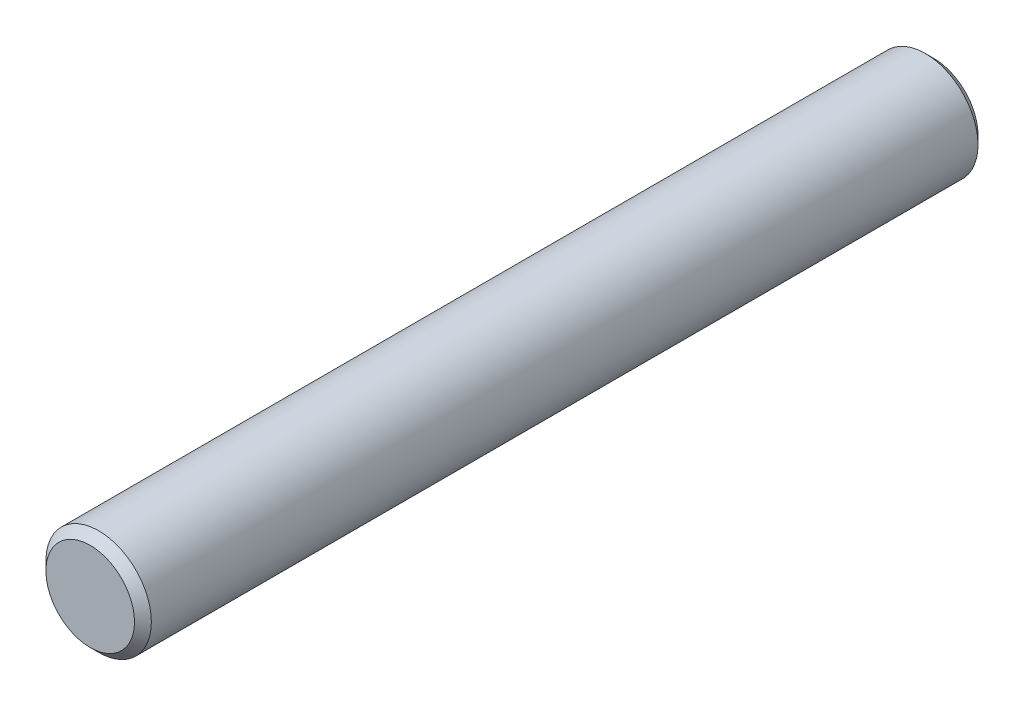
ISO-10303-21;
HEADER;
FILE_DESCRIPTION(('STEP AP214'),'2;1');
FILE_NAME('part.step','',(''),(''),'','','');
FILE_SCHEMA(('AUTOMOTIVE_DESIGN { 1 0 10303 214 1 1 1 1 }'));
ENDSEC;
DATA;
#1=APPLICATION_CONTEXT('core data for automotive mechanical design processes');
#2=APPLICATION_PROTOCOL_DEFINITION('international standard','automotive_design',2000,#1);
#3=PRODUCT_CONTEXT('',#1,'mechanical');
#4=PRODUCT('Part','Part','',(#3));
#5=PRODUCT_RELATED_PRODUCT_CATEGORY('part','',(#4));
#6=PRODUCT_DEFINITION_FORMATION('','',#4);
#7=PRODUCT_DEFINITION_CONTEXT('part definition',#1,'design');
#8=PRODUCT_DEFINITION('design','',#6,#7);
#9=PRODUCT_DEFINITION_SHAPE('','',#8);
#10=(LENGTH_UNIT() NAMED_UNIT(*) SI_UNIT(.MILLI.,.METRE.));
#11=(NAMED_UNIT(*) PLANE_ANGLE_UNIT() SI_UNIT($,.RADIAN.));
#12=(NAMED_UNIT(*) SI_UNIT($,.STERADIAN.) SOLID_ANGLE_UNIT());
#13=UNCERTAINTY_MEASURE_WITH_UNIT(LENGTH_MEASURE(1.E-05),#10,'distance_accuracy_value','');
#14=(GEOMETRIC_REPRESENTATION_CONTEXT(3) GLOBAL_UNCERTAINTY_ASSIGNED_CONTEXT((#13)) GLOBAL_UNIT_ASSIGNED_CONTEXT((#10,
#11,#12)) REPRESENTATION_CONTEXT('',''));
#15=CARTESIAN_POINT('',(0.,0.,0.));
#16=DIRECTION('',(0.,0.,1.));
#17=DIRECTION('',(1.,0.,0.));
#18=AXIS2_PLACEMENT_3D('',#15,#16,#17);
#19=CARTESIAN_POINT('',(0.,0.,25.4));
#20=DIRECTION('',(0.,0.,-1.));
#21=DIRECTION('',(-1.,0.,0.));
#22=AXIS2_PLACEMENT_3D('',#19,#20,#21);
#23=CYLINDRICAL_SURFACE('',#22,1.5875);
#24=CARTESIAN_POINT('',(0.,0.,0.254000000000008));
#25=DIRECTION('',(0.,0.,1.));
#26=DIRECTION('',(1.,0.,0.));
#27=AXIS2_PLACEMENT_3D('',#24,#25,#26);
#28=CIRCLE('',#27,1.5875);
#29=CARTESIAN_POINT('',(1.5875,0.,0.254000000000008));
#30=VERTEX_POINT('',#29);
#31=EDGE_CURVE('E51',#30,#30,#28,.T.);
#32=ORIENTED_EDGE('',*,*,#31,.T.);
#33=EDGE_LOOP('',(#32));
#34=FACE_BOUND('',#33,.T.);
#35=CARTESIAN_POINT('',(0.,0.,25.146));
#36=DIRECTION('',(0.,0.,1.));
#37=DIRECTION('',(1.,0.,0.));
#38=AXIS2_PLACEMENT_3D('',#35,#36,#37);
#39=CIRCLE('',#38,1.5875);
#40=CARTESIAN_POINT('',(1.5875,0.,25.146));
#41=VERTEX_POINT('',#40);
#42=EDGE_CURVE('E54',#41,#41,#39,.F.);
#43=ORIENTED_EDGE('',*,*,#42,.T.);
#44=EDGE_LOOP('',(#43));
#45=FACE_BOUND('',#44,.T.);
#46=ADVANCED_FACE('F39',(#34,#45),#23,.T.);
#47=CARTESIAN_POINT('',(0.,0.,25.4));
#48=DIRECTION('',(0.,0.,1.));
#49=DIRECTION('',(1.,0.,0.));
#50=AXIS2_PLACEMENT_3D('',#47,#48,#49);
#51=PLANE('',#50);
#52=CARTESIAN_POINT('',(0.,0.,25.4));
#53=DIRECTION('',(0.,0.,1.));
#54=DIRECTION('',(1.,0.,0.));
#55=AXIS2_PLACEMENT_3D('',#52,#53,#54);
#56=CIRCLE('',#55,1.3335);
#57=CARTESIAN_POINT('',(1.3335,0.,25.4));
#58=VERTEX_POINT('',#57);
#59=EDGE_CURVE('E10',#58,#58,#56,.T.);
#60=ORIENTED_EDGE('',*,*,#59,.T.);
#61=EDGE_LOOP('',(#60));
#62=FACE_BOUND('',#61,.T.);
#63=ADVANCED_FACE('F72',(#62),#51,.T.);
#64=CARTESIAN_POINT('',(0.,0.,0.));
#65=DIRECTION('',(0.,0.,1.));
#66=DIRECTION('',(1.,0.,0.));
#67=AXIS2_PLACEMENT_3D('',#64,#65,#66);
#68=PLANE('',#67);
#69=CARTESIAN_POINT('',(0.,0.,0.));
#70=DIRECTION('',(0.,0.,1.));
#71=DIRECTION('',(1.,0.,0.));
#72=AXIS2_PLACEMENT_3D('',#69,#70,#71);
#73=CIRCLE('',#72,1.33349999999999);
#74=CARTESIAN_POINT('',(1.33349999999999,0.,0.));
#75=VERTEX_POINT('',#74);
#76=EDGE_CURVE('E50',#75,#75,#73,.F.);
#77=ORIENTED_EDGE('',*,*,#76,.T.);
#78=EDGE_LOOP('',(#77));
#79=FACE_BOUND('',#78,.T.);
#80=ADVANCED_FACE('F67',(#79),#68,.F.);
#81=CARTESIAN_POINT('',(0.,0.,0.254000000000008));
#82=DIRECTION('',(0.,0.,1.));
#83=DIRECTION('',(1.,0.,0.));
#84=AXIS2_PLACEMENT_3D('',#81,#82,#83);
#85=CONICAL_SURFACE('',#84,1.5875,0.78539816339745);
#86=ORIENTED_EDGE('',*,*,#76,.F.);
#87=EDGE_LOOP('',(#86));
#88=FACE_BOUND('',#87,.T.);
#89=ORIENTED_EDGE('',*,*,#31,.F.);
#90=EDGE_LOOP('',(#89));
#91=FACE_BOUND('',#90,.T.);
#92=ADVANCED_FACE('F63',(#88,#91),#85,.T.);
#93=CARTESIAN_POINT('',(0.,0.,25.4));
#94=DIRECTION('',(0.,0.,-1.));
#95=DIRECTION('',(-1.,0.,0.));
#96=AXIS2_PLACEMENT_3D('',#93,#94,#95);
#97=CONICAL_SURFACE('',#96,1.3335,0.785398163397451);
#98=ORIENTED_EDGE('',*,*,#42,.F.);
#99=EDGE_LOOP('',(#98));
#100=FACE_BOUND('',#99,.T.);
#101=ORIENTED_EDGE('',*,*,#59,.F.);
#102=EDGE_LOOP('',(#101));
#103=FACE_BOUND('',#102,.T.);
#104=ADVANCED_FACE('F45',(#100,#103),#97,.T.);
#105=CLOSED_SHELL('',(#46,#63,#80,#92,#104));
#106=MANIFOLD_SOLID_BREP('B2',#105);
#107=ADVANCED_BREP_SHAPE_REPRESENTATION('',(#18,#106),#14);
#108=SHAPE_DEFINITION_REPRESENTATION(#9,#107);
ENDSEC;
END-ISO-10303-21;
